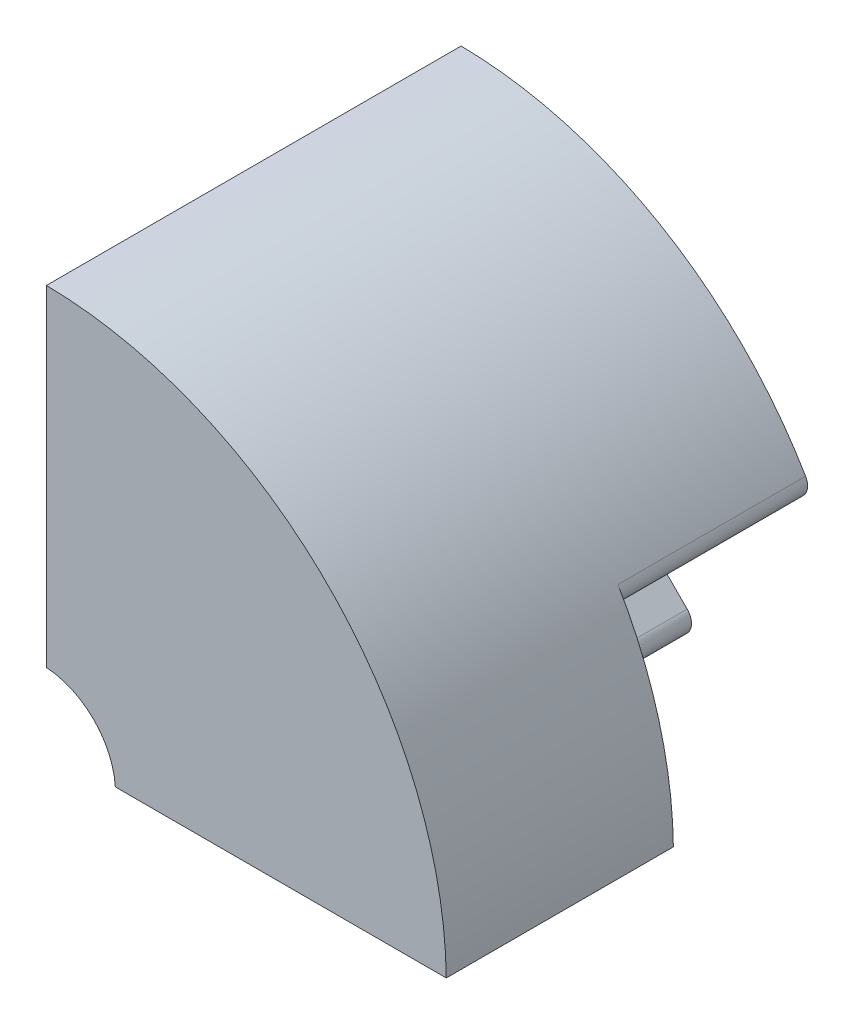
ISO-10303-21;
HEADER;
FILE_DESCRIPTION(('STEP AP214'),'2;1');
FILE_NAME('part.step','',(''),(''),'','','');
FILE_SCHEMA(('AUTOMOTIVE_DESIGN { 1 0 10303 214 1 1 1 1 }'));
ENDSEC;
DATA;
#1=APPLICATION_CONTEXT('core data for automotive mechanical design processes');
#2=APPLICATION_PROTOCOL_DEFINITION('international standard','automotive_design',2000,#1);
#3=PRODUCT_CONTEXT('',#1,'mechanical');
#4=PRODUCT('Part','Part','',(#3));
#5=PRODUCT_RELATED_PRODUCT_CATEGORY('part','',(#4));
#6=PRODUCT_DEFINITION_FORMATION('','',#4);
#7=PRODUCT_DEFINITION_CONTEXT('part definition',#1,'design');
#8=PRODUCT_DEFINITION('design','',#6,#7);
#9=PRODUCT_DEFINITION_SHAPE('','',#8);
#10=(LENGTH_UNIT() NAMED_UNIT(*) SI_UNIT(.MILLI.,.METRE.));
#11=(NAMED_UNIT(*) PLANE_ANGLE_UNIT() SI_UNIT($,.RADIAN.));
#12=(NAMED_UNIT(*) SI_UNIT($,.STERADIAN.) SOLID_ANGLE_UNIT());
#13=UNCERTAINTY_MEASURE_WITH_UNIT(LENGTH_MEASURE(1.E-05),#10,'distance_accuracy_value','');
#14=(GEOMETRIC_REPRESENTATION_CONTEXT(3) GLOBAL_UNCERTAINTY_ASSIGNED_CONTEXT((#13)) GLOBAL_UNIT_ASSIGNED_CONTEXT((#10,
#11,#12)) REPRESENTATION_CONTEXT('',''));
#15=CARTESIAN_POINT('',(0.,0.,0.));
#16=DIRECTION('',(0.,0.,1.));
#17=DIRECTION('',(1.,0.,0.));
#18=AXIS2_PLACEMENT_3D('',#15,#16,#17);
#19=CARTESIAN_POINT('',(0.,0.,-42.));
#20=DIRECTION('',(0.,0.,1.));
#21=DIRECTION('',(1.,0.,0.));
#22=AXIS2_PLACEMENT_3D('',#19,#20,#21);
#23=CYLINDRICAL_SURFACE('',#22,7.5);
#24=DIRECTION('',(0.,0.,1.));
#25=VECTOR('',#24,1.);
#26=CARTESIAN_POINT('',(0.499999999999973,7.48331477354788,-42.));
#27=LINE('',#26,#25);
#28=CARTESIAN_POINT('',(0.49999999999997,7.48331477354788,-27.));
#29=VERTEX_POINT('',#28);
#30=CARTESIAN_POINT('',(0.499999999999973,7.48331477354788,0.));
#31=VERTEX_POINT('',#30);
#32=EDGE_CURVE('E239',#29,#31,#27,.T.);
#33=ORIENTED_EDGE('',*,*,#32,.F.);
#34=CARTESIAN_POINT('',(0.,0.,-27.));
#35=DIRECTION('',(0.,0.,-1.));
#36=DIRECTION('',(-1.,0.,0.));
#37=AXIS2_PLACEMENT_3D('',#34,#35,#36);
#38=CIRCLE('',#37,7.5);
#39=CARTESIAN_POINT('',(7.48331477354788,0.500000000000028,-27.));
#40=VERTEX_POINT('',#39);
#41=EDGE_CURVE('E224',#29,#40,#38,.T.);
#42=ORIENTED_EDGE('',*,*,#41,.T.);
#43=DIRECTION('',(0.,0.,1.));
#44=VECTOR('',#43,1.);
#45=CARTESIAN_POINT('',(7.48331477354788,0.500000000000028,-42.));
#46=LINE('',#45,#44);
#47=CARTESIAN_POINT('',(7.48331477354788,0.500000000000028,0.));
#48=VERTEX_POINT('',#47);
#49=EDGE_CURVE('E247',#40,#48,#46,.T.);
#50=ORIENTED_EDGE('',*,*,#49,.T.);
#51=CARTESIAN_POINT('',(0.,0.,0.));
#52=DIRECTION('',(0.,0.,-1.));
#53=DIRECTION('',(1.,0.,0.));
#54=AXIS2_PLACEMENT_3D('',#51,#52,#53);
#55=CIRCLE('',#54,7.5);
#56=EDGE_CURVE('E244',#31,#48,#55,.T.);
#57=ORIENTED_EDGE('',*,*,#56,.F.);
#58=EDGE_LOOP('',(#33,#42,#50,#57));
#59=FACE_BOUND('',#58,.T.);
#60=ADVANCED_FACE('F42',(#59),#23,.F.);
#61=CARTESIAN_POINT('',(0.,0.,-42.));
#62=DIRECTION('',(0.,0.,1.));
#63=DIRECTION('',(1.,0.,0.));
#64=AXIS2_PLACEMENT_3D('',#61,#62,#63);
#65=CYLINDRICAL_SURFACE('',#64,41.);
#66=CARTESIAN_POINT('',(0.,0.,-23.));
#67=DIRECTION('',(0.,0.,-1.));
#68=DIRECTION('',(-1.,0.,0.));
#69=AXIS2_PLACEMENT_3D('',#66,#67,#68);
#70=CIRCLE('',#69,41.);
#71=CARTESIAN_POINT('',(40.9969511061493,0.500000000000022,-23.));
#72=VERTEX_POINT('',#71);
#73=CARTESIAN_POINT('',(35.3865219662676,20.7073432175849,-23.));
#74=VERTEX_POINT('',#73);
#75=EDGE_CURVE('E505',#72,#74,#70,.F.);
#76=ORIENTED_EDGE('',*,*,#75,.T.);
#77=DIRECTION('',(0.,0.,1.));
#78=VECTOR('',#77,1.);
#79=CARTESIAN_POINT('',(35.3865219662676,20.7073432175849,-42.));
#80=LINE('',#79,#78);
#81=CARTESIAN_POINT('',(35.3865219662676,20.7073432175849,-42.));
#82=VERTEX_POINT('',#81);
#83=EDGE_CURVE('E318',#74,#82,#80,.F.);
#84=ORIENTED_EDGE('',*,*,#83,.T.);
#85=CARTESIAN_POINT('',(0.,0.,-42.));
#86=DIRECTION('',(0.,0.,1.));
#87=DIRECTION('',(1.,0.,0.));
#88=AXIS2_PLACEMENT_3D('',#85,#86,#87);
#89=CIRCLE('',#88,41.);
#90=CARTESIAN_POINT('',(0.499999999999968,40.9969511061494,-42.));
#91=VERTEX_POINT('',#90);
#92=EDGE_CURVE('E561',#82,#91,#89,.T.);
#93=ORIENTED_EDGE('',*,*,#92,.T.);
#94=DIRECTION('',(0.,0.,1.));
#95=VECTOR('',#94,1.);
#96=CARTESIAN_POINT('',(0.499999999999968,40.9969511061494,-42.));
#97=LINE('',#96,#95);
#98=CARTESIAN_POINT('',(0.499999999999968,40.9969511061494,0.));
#99=VERTEX_POINT('',#98);
#100=EDGE_CURVE('E248',#91,#99,#97,.T.);
#101=ORIENTED_EDGE('',*,*,#100,.T.);
#102=CARTESIAN_POINT('',(0.,0.,0.));
#103=DIRECTION('',(0.,0.,1.));
#104=DIRECTION('',(1.,0.,0.));
#105=AXIS2_PLACEMENT_3D('',#102,#103,#104);
#106=CIRCLE('',#105,41.);
#107=CARTESIAN_POINT('',(40.9969511061494,0.500000000000029,0.));
#108=VERTEX_POINT('',#107);
#109=EDGE_CURVE('E553',#108,#99,#106,.T.);
#110=ORIENTED_EDGE('',*,*,#109,.F.);
#111=DIRECTION('',(0.,0.,1.));
#112=VECTOR('',#111,1.);
#113=CARTESIAN_POINT('',(40.9969511061494,0.500000000000029,-42.));
#114=LINE('',#113,#112);
#115=EDGE_CURVE('E252',#72,#108,#114,.T.);
#116=ORIENTED_EDGE('',*,*,#115,.F.);
#117=EDGE_LOOP('',(#76,#84,#93,#101,#110,#116));
#118=FACE_BOUND('',#117,.T.);
#119=ADVANCED_FACE('F398',(#118),#65,.T.);
#120=CARTESIAN_POINT('',(7.48331477354788,0.500000000000028,-42.));
#121=DIRECTION('',(0.,-1.,0.));
#122=DIRECTION('',(1.,0.,0.));
#123=AXIS2_PLACEMENT_3D('',#120,#121,#122);
#124=PLANE('',#123);
#125=DIRECTION('',(-1.,0.,0.));
#126=VECTOR('',#125,1.);
#127=CARTESIAN_POINT('',(0.499999999999971,0.500000000000028,-27.));
#128=LINE('',#127,#126);
#129=CARTESIAN_POINT('',(14.6421356237309,0.500000000000028,-27.));
#130=VERTEX_POINT('',#129);
#131=EDGE_CURVE('E229',#130,#40,#128,.T.);
#132=ORIENTED_EDGE('',*,*,#131,.F.);
#133=CARTESIAN_POINT('',(14.6421356237309,0.500000000000027,-30.));
#134=DIRECTION('',(0.,-1.,0.));
#135=DIRECTION('',(1.,0.,0.));
#136=AXIS2_PLACEMENT_3D('',#133,#134,#135);
#137=ELLIPSE('',#136,4.24264068711929,3.);
#138=CARTESIAN_POINT('',(18.0060966544099,0.500000000000028,-28.1719181932865));
#139=VERTEX_POINT('',#138);
#140=EDGE_CURVE('E11',#130,#139,#137,.F.);
#141=ORIENTED_EDGE('',*,*,#140,.T.);
#142=CARTESIAN_POINT('',(18.0060966544099,0.500000000000028,-28.1719181932865));
#143=CARTESIAN_POINT('',(18.0780374790311,0.500000000000028,-28.2381032540828));
#144=CARTESIAN_POINT('',(18.1482863095157,0.500000000000028,-28.3060812548936));
#145=CARTESIAN_POINT('',(18.2856277397146,0.500000000000028,-28.4450745879636));
#146=CARTESIAN_POINT('',(18.3527223127263,0.500000000000028,-28.5160879667377));
#147=CARTESIAN_POINT('',(18.5494341762897,0.500000000000028,-28.7326423636497));
#148=CARTESIAN_POINT('',(18.6748217771309,0.500000000000029,-28.8820197317656));
#149=CARTESIAN_POINT('',(18.919117831283,0.500000000000028,-29.1895484323767));
#150=CARTESIAN_POINT('',(19.037899091584,0.500000000000028,-29.3477985100827));
#151=CARTESIAN_POINT('',(19.271062885945,0.500000000000029,-29.6677068580553));
#152=CARTESIAN_POINT('',(19.3854407397626,0.50000000000003,-29.8293684864916));
#153=CARTESIAN_POINT('',(19.5018802860047,0.500000000000028,-29.9940371533154));
#154=CARTESIAN_POINT('',(19.5039884711615,0.500000000000028,-29.9970185773145));
#155=CARTESIAN_POINT('',(19.5060966544099,0.500000000000028,-30.));
#156=B_SPLINE_CURVE_WITH_KNOTS('',3,(#142,#143,#144,#145,#146,#147,#148,#149,#150,#151,#152,
#153,#154,#155),.UNSPECIFIED.,.F.,.F.,(4,2,2,2,2,2,4),(0.,0.293185172772144,0.586184419880159,
1.17077770268783,1.76424205277115,2.3583206792288,2.36927513037891),.UNSPECIFIED.);
#157=CARTESIAN_POINT('',(19.5060966544099,0.500000000000029,-30.));
#158=VERTEX_POINT('',#157);
#159=EDGE_CURVE('E373',#139,#158,#156,.T.);
#160=ORIENTED_EDGE('',*,*,#159,.T.);
#161=DIRECTION('',(0.,0.,-1.));
#162=VECTOR('',#161,1.);
#163=CARTESIAN_POINT('',(19.5060966544099,0.500000000000029,-42.));
#164=LINE('',#163,#162);
#165=CARTESIAN_POINT('',(19.5060966544099,0.500000000000028,-42.));
#166=VERTEX_POINT('',#165);
#167=EDGE_CURVE('E293',#158,#166,#164,.T.);
#168=ORIENTED_EDGE('',*,*,#167,.T.);
#169=DIRECTION('',(1.,0.,0.));
#170=VECTOR('',#169,1.);
#171=CARTESIAN_POINT('',(7.48331477354788,0.500000000000028,-42.));
#172=LINE('',#171,#170);
#173=CARTESIAN_POINT('',(22.3345237791561,0.500000000000028,-42.));
#174=VERTEX_POINT('',#173);
#175=EDGE_CURVE('E254',#166,#174,#172,.T.);
#176=ORIENTED_EDGE('',*,*,#175,.T.);
#177=DIRECTION('',(0.,0.,-1.));
#178=VECTOR('',#177,1.);
#179=CARTESIAN_POINT('',(22.3345237791561,0.500000000000029,-23.));
#180=LINE('',#179,#178);
#181=CARTESIAN_POINT('',(22.3345237791561,0.500000000000031,-23.));
#182=VERTEX_POINT('',#181);
#183=EDGE_CURVE('E289',#174,#182,#180,.F.);
#184=ORIENTED_EDGE('',*,*,#183,.T.);
#185=DIRECTION('',(1.,0.,0.));
#186=VECTOR('',#185,1.);
#187=CARTESIAN_POINT('',(25.9558441227157,0.50000000000003,-23.));
#188=LINE('',#187,#186);
#189=EDGE_CURVE('E585',#182,#72,#188,.T.);
#190=ORIENTED_EDGE('',*,*,#189,.T.);
#191=ORIENTED_EDGE('',*,*,#115,.T.);
#192=DIRECTION('',(1.,0.,0.));
#193=VECTOR('',#192,1.);
#194=CARTESIAN_POINT('',(7.48331477354788,0.500000000000028,0.));
#195=LINE('',#194,#193);
#196=EDGE_CURVE('E565',#48,#108,#195,.T.);
#197=ORIENTED_EDGE('',*,*,#196,.F.);
#198=ORIENTED_EDGE('',*,*,#49,.F.);
#199=EDGE_LOOP('',(#132,#141,#160,#168,#176,#184,#190,#191,#197,#198));
#200=FACE_BOUND('',#199,.T.);
#201=ADVANCED_FACE('F402',(#200),#124,.T.);
#202=CARTESIAN_POINT('',(0.499999999999968,40.9969511061494,-42.));
#203=DIRECTION('',(-1.,0.,0.));
#204=DIRECTION('',(0.,-1.,0.));
#205=AXIS2_PLACEMENT_3D('',#202,#203,#204);
#206=PLANE('',#205);
#207=DIRECTION('',(0.,-1.,0.));
#208=VECTOR('',#207,1.);
#209=CARTESIAN_POINT('',(0.499999999999968,40.9969511061494,-42.));
#210=LINE('',#209,#208);
#211=CARTESIAN_POINT('',(0.499999999999971,19.5060966544099,-42.));
#212=VERTEX_POINT('',#211);
#213=EDGE_CURVE('E564',#91,#212,#210,.T.);
#214=ORIENTED_EDGE('',*,*,#213,.T.);
#215=DIRECTION('',(0.,0.,-1.));
#216=VECTOR('',#215,1.);
#217=CARTESIAN_POINT('',(0.499999999999972,19.5060966544099,-27.));
#218=LINE('',#217,#216);
#219=CARTESIAN_POINT('',(0.499999999999972,19.5060966544099,-30.));
#220=VERTEX_POINT('',#219);
#221=EDGE_CURVE('E286',#212,#220,#218,.F.);
#222=ORIENTED_EDGE('',*,*,#221,.T.);
#223=CARTESIAN_POINT('',(0.499999999999971,18.0060966544099,-28.1719181932865));
#224=CARTESIAN_POINT('',(0.499999999999971,18.078037479031,-28.2381032540828));
#225=CARTESIAN_POINT('',(0.499999999999972,18.1482863095156,-28.3060812548934));
#226=CARTESIAN_POINT('',(0.499999999999971,18.2856277397143,-28.4450745879632));
#227=CARTESIAN_POINT('',(0.499999999999971,18.3527223127259,-28.5160879667371));
#228=CARTESIAN_POINT('',(0.499999999999972,18.5494341762893,-28.7326423636493));
#229=CARTESIAN_POINT('',(0.499999999999974,18.6748217771301,-28.8820197317658));
#230=CARTESIAN_POINT('',(0.499999999999969,18.9191178312837,-29.1895484323762));
#231=CARTESIAN_POINT('',(0.499999999999962,19.0378990915866,-29.3477985100808));
#232=CARTESIAN_POINT('',(0.499999999999981,19.2710628859424,-29.6677068580571));
#233=CARTESIAN_POINT('',(0.500000000000007,19.3854407397531,-29.8293684864983));
#234=CARTESIAN_POINT('',(0.499999999999971,19.5018802860044,-29.9940371533156));
#235=CARTESIAN_POINT('',(0.49999999999997,19.5039884711614,-29.9970185773146));
#236=CARTESIAN_POINT('',(0.499999999999969,19.5060966544099,-30.));
#237=B_SPLINE_CURVE_WITH_KNOTS('',3,(#223,#224,#225,#226,#227,#228,#229,#230,#231,#232,#233,
#234,#235,#236),.UNSPECIFIED.,.F.,.F.,(4,2,2,2,2,2,4),(0.,0.293185172771793,0.586184419879292,
1.17077770268776,1.7642420527711,2.35832067922879,2.36927513037891),.UNSPECIFIED.);
#238=CARTESIAN_POINT('',(0.499999999999971,18.0060966544099,-28.1719181932865));
#239=VERTEX_POINT('',#238);
#240=EDGE_CURVE('E67',#220,#239,#237,.F.);
#241=ORIENTED_EDGE('',*,*,#240,.T.);
#242=CARTESIAN_POINT('',(0.499999999999971,14.642135623731,-30.));
#243=DIRECTION('',(-1.,0.,0.));
#244=DIRECTION('',(0.,-1.,0.));
#245=AXIS2_PLACEMENT_3D('',#242,#243,#244);
#246=ELLIPSE('',#245,4.24264068711929,3.);
#247=CARTESIAN_POINT('',(0.499999999999968,14.642135623731,-27.));
#248=VERTEX_POINT('',#247);
#249=EDGE_CURVE('E53',#239,#248,#246,.F.);
#250=ORIENTED_EDGE('',*,*,#249,.T.);
#251=DIRECTION('',(0.,1.,0.));
#252=VECTOR('',#251,1.);
#253=CARTESIAN_POINT('',(0.499999999999968,18.8847763108503,-27.));
#254=LINE('',#253,#252);
#255=EDGE_CURVE('E227',#29,#248,#254,.T.);
#256=ORIENTED_EDGE('',*,*,#255,.F.);
#257=ORIENTED_EDGE('',*,*,#32,.T.);
#258=DIRECTION('',(0.,-1.,0.));
#259=VECTOR('',#258,1.);
#260=CARTESIAN_POINT('',(0.499999999999968,40.9969511061494,0.));
#261=LINE('',#260,#259);
#262=EDGE_CURVE('E574',#99,#31,#261,.T.);
#263=ORIENTED_EDGE('',*,*,#262,.F.);
#264=ORIENTED_EDGE('',*,*,#100,.F.);
#265=EDGE_LOOP('',(#214,#222,#241,#250,#256,#257,#263,#264));
#266=FACE_BOUND('',#265,.T.);
#267=ADVANCED_FACE('F237',(#266),#206,.T.);
#268=CARTESIAN_POINT('',(0.,0.,-42.));
#269=DIRECTION('',(0.,0.,1.));
#270=DIRECTION('',(1.,0.,0.));
#271=AXIS2_PLACEMENT_3D('',#268,#269,#270);
#272=PLANE('',#271);
#273=DIRECTION('',(0.707106781186548,-0.707106781186547,0.));
#274=VECTOR('',#273,1.);
#275=CARTESIAN_POINT('',(18.8847763108502,0.500000000000028,-42.));
#276=LINE('',#275,#274);
#277=CARTESIAN_POINT('',(0.939339828220153,18.4454364826301,-42.));
#278=VERTEX_POINT('',#277);
#279=CARTESIAN_POINT('',(18.44543648263,0.939339828220205,-42.));
#280=VERTEX_POINT('',#279);
#281=EDGE_CURVE('E593',#278,#280,#276,.T.);
#282=ORIENTED_EDGE('',*,*,#281,.F.);
#283=CARTESIAN_POINT('',(1.99999999999997,19.5060966544099,-42.));
#284=DIRECTION('',(0.,0.,1.));
#285=DIRECTION('',(1.,0.,0.));
#286=AXIS2_PLACEMENT_3D('',#283,#284,#285);
#287=CIRCLE('',#286,1.5);
#288=EDGE_CURVE('E283',#278,#212,#287,.F.);
#289=ORIENTED_EDGE('',*,*,#288,.T.);
#290=ORIENTED_EDGE('',*,*,#213,.F.);
#291=ORIENTED_EDGE('',*,*,#92,.F.);
#292=CARTESIAN_POINT('',(34.0918931138432,19.9497574901123,-42.));
#293=DIRECTION('',(0.,0.,1.));
#294=DIRECTION('',(1.,0.,0.));
#295=AXIS2_PLACEMENT_3D('',#292,#293,#294);
#296=CIRCLE('',#295,1.5);
#297=CARTESIAN_POINT('',(35.152553285623,18.8890973183325,-42.));
#298=VERTEX_POINT('',#297);
#299=EDGE_CURVE('E268',#82,#298,#296,.F.);
#300=ORIENTED_EDGE('',*,*,#299,.T.);
#301=DIRECTION('',(0.707106781186547,0.707106781186547,0.));
#302=VECTOR('',#301,1.);
#303=CARTESIAN_POINT('',(34.087572106361,17.8241161390705,-42.));
#304=LINE('',#303,#302);
#305=CARTESIAN_POINT('',(35.1482322781408,18.8847763108503,-42.));
#306=VERTEX_POINT('',#305);
#307=EDGE_CURVE('E643',#306,#298,#304,.T.);
#308=ORIENTED_EDGE('',*,*,#307,.F.);
#309=CARTESIAN_POINT('',(34.087572106361,19.9454364826301,-42.));
#310=DIRECTION('',(0.,0.,1.));
#311=DIRECTION('',(1.,0.,0.));
#312=AXIS2_PLACEMENT_3D('',#309,#310,#311);
#313=CIRCLE('',#312,1.5);
#314=CARTESIAN_POINT('',(33.0269119345812,18.8847763108503,-42.));
#315=VERTEX_POINT('',#314);
#316=EDGE_CURVE('E265',#306,#315,#313,.F.);
#317=ORIENTED_EDGE('',*,*,#316,.T.);
#318=DIRECTION('',(-0.707106781186547,0.707106781186548,0.));
#319=VECTOR('',#318,1.);
#320=CARTESIAN_POINT('',(25.9558441227158,25.9558441227157,-42.));
#321=LINE('',#320,#319);
#322=CARTESIAN_POINT('',(14.2885822331377,37.6231060122938,-42.));
#323=VERTEX_POINT('',#322);
#324=EDGE_CURVE('E529',#315,#323,#321,.T.);
#325=ORIENTED_EDGE('',*,*,#324,.T.);
#326=DIRECTION('',(-0.707106781186548,-0.707106781186547,0.));
#327=VECTOR('',#326,1.);
#328=CARTESIAN_POINT('',(-11.6672618895781,11.6672618895781,-42.));
#329=LINE('',#328,#327);
#330=CARTESIAN_POINT('',(12.5208152801713,35.8553390593274,-42.));
#331=VERTEX_POINT('',#330);
#332=EDGE_CURVE('E543',#323,#331,#329,.T.);
#333=ORIENTED_EDGE('',*,*,#332,.T.);
#334=CARTESIAN_POINT('',(11.4601551083915,36.9159992311072,-42.));
#335=DIRECTION('',(0.,0.,1.));
#336=DIRECTION('',(1.,0.,0.));
#337=AXIS2_PLACEMENT_3D('',#334,#335,#336);
#338=CIRCLE('',#337,1.5);
#339=CARTESIAN_POINT('',(10.3994949366116,35.8553390593274,-42.));
#340=VERTEX_POINT('',#339);
#341=EDGE_CURVE('E277',#331,#340,#338,.F.);
#342=ORIENTED_EDGE('',*,*,#341,.T.);
#343=DIRECTION('',(-0.707106781186548,0.707106781186548,0.));
#344=VECTOR('',#343,1.);
#345=CARTESIAN_POINT('',(23.1274169979695,23.1274169979695,-42.));
#346=LINE('',#345,#344);
#347=CARTESIAN_POINT('',(6.8639610306789,39.3908729652602,-42.));
#348=VERTEX_POINT('',#347);
#349=EDGE_CURVE('E540',#340,#348,#346,.T.);
#350=ORIENTED_EDGE('',*,*,#349,.T.);
#351=DIRECTION('',(-0.707106781186547,-0.707106781186548,0.));
#352=VECTOR('',#351,1.);
#353=CARTESIAN_POINT('',(-16.2634559672906,16.2634559672906,-42.));
#354=LINE('',#353,#352);
#355=CARTESIAN_POINT('',(2.62132034355963,35.1482322781409,-42.));
#356=VERTEX_POINT('',#355);
#357=EDGE_CURVE('E517',#348,#356,#354,.T.);
#358=ORIENTED_EDGE('',*,*,#357,.T.);
#359=DIRECTION('',(-0.707106781186548,0.707106781186548,0.));
#360=VECTOR('',#359,1.);
#361=CARTESIAN_POINT('',(18.8847763108502,18.8847763108502,-42.));
#362=LINE('',#361,#360);
#363=CARTESIAN_POINT('',(5.1669047558312,32.6026478658693,-42.));
#364=VERTEX_POINT('',#363);
#365=EDGE_CURVE('E512',#364,#356,#362,.T.);
#366=ORIENTED_EDGE('',*,*,#365,.F.);
#367=CARTESIAN_POINT('',(4.10624458405138,31.5419876940895,-42.));
#368=DIRECTION('',(0.,0.,1.));
#369=DIRECTION('',(1.,0.,0.));
#370=AXIS2_PLACEMENT_3D('',#367,#368,#369);
#371=CIRCLE('',#370,1.5);
#372=CARTESIAN_POINT('',(5.1669047558312,30.4813275223096,-42.));
#373=VERTEX_POINT('',#372);
#374=EDGE_CURVE('E274',#364,#373,#371,.F.);
#375=ORIENTED_EDGE('',*,*,#374,.T.);
#376=DIRECTION('',(0.707106781186547,0.707106781186548,0.));
#377=VECTOR('',#376,1.);
#378=CARTESIAN_POINT('',(6.22756492761102,31.5419876940895,-42.));
#379=LINE('',#378,#377);
#380=CARTESIAN_POINT('',(0.570710678118639,25.8851334445971,-42.));
#381=VERTEX_POINT('',#380);
#382=EDGE_CURVE('E662',#381,#373,#379,.T.);
#383=ORIENTED_EDGE('',*,*,#382,.F.);
#384=DIRECTION('',(-0.707106781186548,0.707106781186548,0.));
#385=VECTOR('',#384,1.);
#386=CARTESIAN_POINT('',(25.9558441227157,0.50000000000003,-42.));
#387=LINE('',#386,#385);
#388=CARTESIAN_POINT('',(23.3951839509359,3.06066017177985,-42.));
#389=VERTEX_POINT('',#388);
#390=EDGE_CURVE('E660',#389,#381,#387,.T.);
#391=ORIENTED_EDGE('',*,*,#390,.F.);
#392=CARTESIAN_POINT('',(22.3345237791561,2.00000000000003,-42.));
#393=DIRECTION('',(0.,0.,1.));
#394=DIRECTION('',(1.,0.,0.));
#395=AXIS2_PLACEMENT_3D('',#392,#393,#394);
#396=CIRCLE('',#395,1.5);
#397=EDGE_CURVE('E271',#389,#174,#396,.F.);
#398=ORIENTED_EDGE('',*,*,#397,.T.);
#399=ORIENTED_EDGE('',*,*,#175,.F.);
#400=CARTESIAN_POINT('',(19.5060966544099,2.00000000000003,-42.));
#401=DIRECTION('',(0.,0.,1.));
#402=DIRECTION('',(1.,0.,0.));
#403=AXIS2_PLACEMENT_3D('',#400,#401,#402);
#404=CIRCLE('',#403,1.5);
#405=EDGE_CURVE('E280',#166,#280,#404,.F.);
#406=ORIENTED_EDGE('',*,*,#405,.T.);
#407=EDGE_LOOP('',(#282,#289,#290,#291,#300,#308,#317,#325,#333,#342,#350,#358,#366,#375,#383,
#391,#398,#399,#406));
#408=FACE_BOUND('',#407,.T.);
#409=ADVANCED_FACE('F411',(#408),#272,.F.);
#410=CARTESIAN_POINT('',(0.,0.,0.));
#411=DIRECTION('',(0.,0.,1.));
#412=DIRECTION('',(1.,0.,0.));
#413=AXIS2_PLACEMENT_3D('',#410,#411,#412);
#414=PLANE('',#413);
#415=ORIENTED_EDGE('',*,*,#109,.T.);
#416=ORIENTED_EDGE('',*,*,#262,.T.);
#417=ORIENTED_EDGE('',*,*,#56,.T.);
#418=ORIENTED_EDGE('',*,*,#196,.T.);
#419=EDGE_LOOP('',(#415,#416,#417,#418));
#420=FACE_BOUND('',#419,.T.);
#421=ADVANCED_FACE('F407',(#420),#414,.T.);
#422=CARTESIAN_POINT('',(25.9558441227158,25.9558441227157,-23.));
#423=DIRECTION('',(-0.707106781186548,-0.707106781186547,0.));
#424=DIRECTION('',(0.707106781186547,-0.707106781186548,0.));
#425=AXIS2_PLACEMENT_3D('',#422,#423,#424);
#426=PLANE('',#425);
#427=ORIENTED_EDGE('',*,*,#324,.F.);
#428=DIRECTION('',(0.,0.,-1.));
#429=VECTOR('',#428,1.);
#430=CARTESIAN_POINT('',(33.0269119345812,18.8847763108503,-23.));
#431=LINE('',#430,#429);
#432=CARTESIAN_POINT('',(33.0269119345812,18.8847763108503,-23.));
#433=VERTEX_POINT('',#432);
#434=EDGE_CURVE('E332',#315,#433,#431,.F.);
#435=ORIENTED_EDGE('',*,*,#434,.T.);
#436=DIRECTION('',(0.707106781186547,-0.707106781186548,0.));
#437=VECTOR('',#436,1.);
#438=CARTESIAN_POINT('',(25.9558441227158,25.9558441227157,-23.));
#439=LINE('',#438,#437);
#440=CARTESIAN_POINT('',(34.087572106361,17.8241161390705,-23.));
#441=VERTEX_POINT('',#440);
#442=EDGE_CURVE('E329',#433,#441,#439,.T.);
#443=ORIENTED_EDGE('',*,*,#442,.T.);
#444=DIRECTION('',(0.,0.,-1.));
#445=VECTOR('',#444,1.);
#446=CARTESIAN_POINT('',(34.087572106361,17.8241161390705,-1.));
#447=LINE('',#446,#445);
#448=CARTESIAN_POINT('',(34.087572106361,17.8241161390705,-1.));
#449=VERTEX_POINT('',#448);
#450=EDGE_CURVE('E632',#449,#441,#447,.T.);
#451=ORIENTED_EDGE('',*,*,#450,.F.);
#452=DIRECTION('',(0.707106781186547,-0.707106781186548,0.));
#453=VECTOR('',#452,1.);
#454=CARTESIAN_POINT('',(14.2885822331377,37.6231060122938,-1.));
#455=LINE('',#454,#453);
#456=CARTESIAN_POINT('',(14.2885822331377,37.6231060122938,-1.));
#457=VERTEX_POINT('',#456);
#458=EDGE_CURVE('E619',#457,#449,#455,.T.);
#459=ORIENTED_EDGE('',*,*,#458,.F.);
#460=DIRECTION('',(0.,0.,-1.));
#461=VECTOR('',#460,1.);
#462=CARTESIAN_POINT('',(14.2885822331377,37.6231060122938,-23.));
#463=LINE('',#462,#461);
#464=EDGE_CURVE('E549',#457,#323,#463,.T.);
#465=ORIENTED_EDGE('',*,*,#464,.T.);
#466=EDGE_LOOP('',(#427,#435,#443,#451,#459,#465));
#467=FACE_BOUND('',#466,.T.);
#468=ADVANCED_FACE('F410',(#467),#426,.T.);
#469=CARTESIAN_POINT('',(-11.6672618895781,11.6672618895781,-23.));
#470=DIRECTION('',(0.707106781186547,-0.707106781186549,0.));
#471=DIRECTION('',(0.707106781186549,0.707106781186547,0.));
#472=AXIS2_PLACEMENT_3D('',#469,#470,#471);
#473=PLANE('',#472);
#474=DIRECTION('',(0.707106781186549,0.707106781186547,0.));
#475=VECTOR('',#474,1.);
#476=CARTESIAN_POINT('',(-11.6672618895781,11.6672618895781,-23.));
#477=LINE('',#476,#475);
#478=CARTESIAN_POINT('',(11.4601551083915,34.7946788875476,-23.));
#479=VERTEX_POINT('',#478);
#480=CARTESIAN_POINT('',(12.5208152801713,35.8553390593274,-23.));
#481=VERTEX_POINT('',#480);
#482=EDGE_CURVE('E296',#479,#481,#477,.T.);
#483=ORIENTED_EDGE('',*,*,#482,.T.);
#484=DIRECTION('',(0.,0.,-1.));
#485=VECTOR('',#484,1.);
#486=CARTESIAN_POINT('',(12.5208152801713,35.8553390593274,-23.));
#487=LINE('',#486,#485);
#488=EDGE_CURVE('E300',#481,#331,#487,.T.);
#489=ORIENTED_EDGE('',*,*,#488,.T.);
#490=ORIENTED_EDGE('',*,*,#332,.F.);
#491=ORIENTED_EDGE('',*,*,#464,.F.);
#492=DIRECTION('',(0.707106781186548,0.707106781186547,0.));
#493=VECTOR('',#492,1.);
#494=CARTESIAN_POINT('',(14.2885822331377,37.6231060122938,-1.));
#495=LINE('',#494,#493);
#496=CARTESIAN_POINT('',(11.4601551083915,34.7946788875476,-1.));
#497=VERTEX_POINT('',#496);
#498=EDGE_CURVE('E615',#497,#457,#495,.T.);
#499=ORIENTED_EDGE('',*,*,#498,.F.);
#500=DIRECTION('',(0.,0.,-1.));
#501=VECTOR('',#500,1.);
#502=CARTESIAN_POINT('',(11.4601551083915,34.7946788875476,-1.));
#503=LINE('',#502,#501);
#504=EDGE_CURVE('E639',#497,#479,#503,.T.);
#505=ORIENTED_EDGE('',*,*,#504,.T.);
#506=EDGE_LOOP('',(#483,#489,#490,#491,#499,#505));
#507=FACE_BOUND('',#506,.T.);
#508=ADVANCED_FACE('F426',(#507),#473,.T.);
#509=CARTESIAN_POINT('',(23.1274169979695,23.1274169979695,-23.));
#510=DIRECTION('',(-0.707106781186548,-0.707106781186548,0.));
#511=DIRECTION('',(0.707106781186548,-0.707106781186548,0.));
#512=AXIS2_PLACEMENT_3D('',#509,#510,#511);
#513=PLANE('',#512);
#514=ORIENTED_EDGE('',*,*,#349,.F.);
#515=DIRECTION('',(0.,0.,-1.));
#516=VECTOR('',#515,1.);
#517=CARTESIAN_POINT('',(10.3994949366116,35.8553390593274,-23.));
#518=LINE('',#517,#516);
#519=CARTESIAN_POINT('',(10.3994949366116,35.8553390593274,-23.));
#520=VERTEX_POINT('',#519);
#521=EDGE_CURVE('E304',#340,#520,#518,.F.);
#522=ORIENTED_EDGE('',*,*,#521,.T.);
#523=DIRECTION('',(-0.707106781186548,0.707106781186548,0.));
#524=VECTOR('',#523,1.);
#525=CARTESIAN_POINT('',(23.1274169979695,23.1274169979695,-23.));
#526=LINE('',#525,#524);
#527=CARTESIAN_POINT('',(6.8639610306789,39.3908729652602,-23.));
#528=VERTEX_POINT('',#527);
#529=EDGE_CURVE('E533',#520,#528,#526,.T.);
#530=ORIENTED_EDGE('',*,*,#529,.T.);
#531=DIRECTION('',(0.,0.,-1.));
#532=VECTOR('',#531,1.);
#533=CARTESIAN_POINT('',(6.8639610306789,39.3908729652602,-23.));
#534=LINE('',#533,#532);
#535=EDGE_CURVE('E554',#528,#348,#534,.T.);
#536=ORIENTED_EDGE('',*,*,#535,.T.);
#537=EDGE_LOOP('',(#514,#522,#530,#536));
#538=FACE_BOUND('',#537,.T.);
#539=ADVANCED_FACE('F424',(#538),#513,.T.);
#540=CARTESIAN_POINT('',(-16.2634559672906,16.2634559672906,-23.));
#541=DIRECTION('',(0.707106781186548,-0.707106781186547,0.));
#542=DIRECTION('',(0.707106781186547,0.707106781186548,0.));
#543=AXIS2_PLACEMENT_3D('',#540,#541,#542);
#544=PLANE('',#543);
#545=ORIENTED_EDGE('',*,*,#357,.F.);
#546=ORIENTED_EDGE('',*,*,#535,.F.);
#547=DIRECTION('',(-0.707106781186547,-0.707106781186548,0.));
#548=VECTOR('',#547,1.);
#549=CARTESIAN_POINT('',(-16.2634559672906,16.2634559672906,-23.));
#550=LINE('',#549,#548);
#551=CARTESIAN_POINT('',(2.62132034355963,35.1482322781409,-23.));
#552=VERTEX_POINT('',#551);
#553=EDGE_CURVE('E528',#528,#552,#550,.T.);
#554=ORIENTED_EDGE('',*,*,#553,.T.);
#555=DIRECTION('',(0.,0.,-1.));
#556=VECTOR('',#555,1.);
#557=CARTESIAN_POINT('',(2.62132034355963,35.1482322781409,-23.));
#558=LINE('',#557,#556);
#559=EDGE_CURVE('E535',#552,#356,#558,.T.);
#560=ORIENTED_EDGE('',*,*,#559,.T.);
#561=EDGE_LOOP('',(#545,#546,#554,#560));
#562=FACE_BOUND('',#561,.T.);
#563=ADVANCED_FACE('F420',(#562),#544,.T.);
#564=CARTESIAN_POINT('',(18.8847763108502,18.8847763108502,-23.));
#565=DIRECTION('',(-0.707106781186548,-0.707106781186548,0.));
#566=DIRECTION('',(0.707106781186548,-0.707106781186548,0.));
#567=AXIS2_PLACEMENT_3D('',#564,#565,#566);
#568=PLANE('',#567);
#569=DIRECTION('',(-0.707106781186548,0.707106781186548,0.));
#570=VECTOR('',#569,1.);
#571=CARTESIAN_POINT('',(18.8847763108502,18.8847763108502,-23.));
#572=LINE('',#571,#570);
#573=CARTESIAN_POINT('',(5.1669047558312,32.6026478658693,-23.));
#574=VERTEX_POINT('',#573);
#575=EDGE_CURVE('E525',#574,#552,#572,.T.);
#576=ORIENTED_EDGE('',*,*,#575,.F.);
#577=DIRECTION('',(0.,0.,-1.));
#578=VECTOR('',#577,1.);
#579=CARTESIAN_POINT('',(5.1669047558312,32.6026478658693,-23.));
#580=LINE('',#579,#578);
#581=EDGE_CURVE('E307',#574,#364,#580,.T.);
#582=ORIENTED_EDGE('',*,*,#581,.T.);
#583=ORIENTED_EDGE('',*,*,#365,.T.);
#584=ORIENTED_EDGE('',*,*,#559,.F.);
#585=EDGE_LOOP('',(#576,#582,#583,#584));
#586=FACE_BOUND('',#585,.T.);
#587=ADVANCED_FACE('F416',(#586),#568,.F.);
#588=CARTESIAN_POINT('',(0.,0.,-23.));
#589=DIRECTION('',(0.,0.,-1.));
#590=DIRECTION('',(-1.,0.,0.));
#591=AXIS2_PLACEMENT_3D('',#588,#589,#590);
#592=PLANE('',#591);
#593=DIRECTION('',(-0.707106781186547,0.707106781186548,0.));
#594=VECTOR('',#593,1.);
#595=CARTESIAN_POINT('',(11.4601551083915,34.7946788875476,-23.));
#596=LINE('',#595,#594);
#597=CARTESIAN_POINT('',(31.2591449816148,14.9956890143243,-23.));
#598=VERTEX_POINT('',#597);
#599=EDGE_CURVE('E620',#598,#479,#596,.T.);
#600=ORIENTED_EDGE('',*,*,#599,.F.);
#601=DIRECTION('',(-0.707106781186548,-0.707106781186548,0.));
#602=VECTOR('',#601,1.);
#603=CARTESIAN_POINT('',(34.087572106361,17.8241161390705,-23.));
#604=LINE('',#603,#602);
#605=EDGE_CURVE('E234',#441,#598,#604,.T.);
#606=ORIENTED_EDGE('',*,*,#605,.F.);
#607=ORIENTED_EDGE('',*,*,#442,.F.);
#608=CARTESIAN_POINT('',(34.087572106361,19.9454364826301,-23.));
#609=DIRECTION('',(0.,0.,-1.));
#610=DIRECTION('',(-1.,0.,0.));
#611=AXIS2_PLACEMENT_3D('',#608,#609,#610);
#612=CIRCLE('',#611,1.5);
#613=CARTESIAN_POINT('',(35.1482322781408,18.8847763108503,-23.));
#614=VERTEX_POINT('',#613);
#615=EDGE_CURVE('E349',#433,#614,#612,.F.);
#616=ORIENTED_EDGE('',*,*,#615,.T.);
#617=DIRECTION('',(-0.707106781186548,-0.707106781186548,0.));
#618=VECTOR('',#617,1.);
#619=CARTESIAN_POINT('',(34.087572106361,17.8241161390705,-23.));
#620=LINE('',#619,#618);
#621=CARTESIAN_POINT('',(35.152553285623,18.8890973183325,-23.));
#622=VERTEX_POINT('',#621);
#623=EDGE_CURVE('E508',#622,#614,#620,.T.);
#624=ORIENTED_EDGE('',*,*,#623,.F.);
#625=CARTESIAN_POINT('',(34.0918931138432,19.9497574901123,-23.));
#626=DIRECTION('',(0.,0.,-1.));
#627=DIRECTION('',(-1.,0.,0.));
#628=AXIS2_PLACEMENT_3D('',#625,#626,#627);
#629=CIRCLE('',#628,1.5);
#630=EDGE_CURVE('E345',#622,#74,#629,.F.);
#631=ORIENTED_EDGE('',*,*,#630,.T.);
#632=ORIENTED_EDGE('',*,*,#75,.F.);
#633=ORIENTED_EDGE('',*,*,#189,.F.);
#634=CARTESIAN_POINT('',(22.3345237791561,2.00000000000003,-23.));
#635=DIRECTION('',(0.,0.,-1.));
#636=DIRECTION('',(-1.,0.,0.));
#637=AXIS2_PLACEMENT_3D('',#634,#635,#636);
#638=CIRCLE('',#637,1.5);
#639=CARTESIAN_POINT('',(23.3951839509359,3.06066017177985,-23.));
#640=VERTEX_POINT('',#639);
#641=EDGE_CURVE('E342',#182,#640,#638,.F.);
#642=ORIENTED_EDGE('',*,*,#641,.T.);
#643=DIRECTION('',(0.707106781186548,-0.707106781186548,0.));
#644=VECTOR('',#643,1.);
#645=CARTESIAN_POINT('',(25.9558441227157,0.50000000000003,-23.));
#646=LINE('',#645,#644);
#647=CARTESIAN_POINT('',(0.57071067811864,25.8851334445971,-23.));
#648=VERTEX_POINT('',#647);
#649=EDGE_CURVE('E519',#648,#640,#646,.T.);
#650=ORIENTED_EDGE('',*,*,#649,.F.);
#651=DIRECTION('',(-0.707106781186547,-0.707106781186548,0.));
#652=VECTOR('',#651,1.);
#653=CARTESIAN_POINT('',(6.22756492761102,31.5419876940895,-23.));
#654=LINE('',#653,#652);
#655=CARTESIAN_POINT('',(5.1669047558312,30.4813275223096,-23.));
#656=VERTEX_POINT('',#655);
#657=EDGE_CURVE('E513',#656,#648,#654,.T.);
#658=ORIENTED_EDGE('',*,*,#657,.F.);
#659=CARTESIAN_POINT('',(4.10624458405138,31.5419876940895,-23.));
#660=DIRECTION('',(0.,0.,-1.));
#661=DIRECTION('',(-1.,0.,0.));
#662=AXIS2_PLACEMENT_3D('',#659,#660,#661);
#663=CIRCLE('',#662,1.5);
#664=EDGE_CURVE('E339',#656,#574,#663,.F.);
#665=ORIENTED_EDGE('',*,*,#664,.T.);
#666=ORIENTED_EDGE('',*,*,#575,.T.);
#667=ORIENTED_EDGE('',*,*,#553,.F.);
#668=ORIENTED_EDGE('',*,*,#529,.F.);
#669=CARTESIAN_POINT('',(11.4601551083915,36.9159992311072,-23.));
#670=DIRECTION('',(0.,0.,-1.));
#671=DIRECTION('',(-1.,0.,0.));
#672=AXIS2_PLACEMENT_3D('',#669,#670,#671);
#673=CIRCLE('',#672,1.5);
#674=EDGE_CURVE('E336',#520,#481,#673,.F.);
#675=ORIENTED_EDGE('',*,*,#674,.T.);
#676=ORIENTED_EDGE('',*,*,#482,.F.);
#677=EDGE_LOOP('',(#600,#606,#607,#616,#624,#631,#632,#633,#642,#650,#658,#665,#666,#667,#668,
#675,#676));
#678=FACE_BOUND('',#677,.T.);
#679=ADVANCED_FACE('F419',(#678),#592,.T.);
#680=CARTESIAN_POINT('',(6.22756492761102,31.5419876940895,27.9694606126545));
#681=DIRECTION('',(-0.707106781186548,0.707106781186547,0.));
#682=DIRECTION('',(-0.707106781186547,-0.707106781186548,0.));
#683=AXIS2_PLACEMENT_3D('',#680,#681,#682);
#684=PLANE('',#683);
#685=ORIENTED_EDGE('',*,*,#382,.T.);
#686=DIRECTION('',(0.,0.,-1.));
#687=VECTOR('',#686,1.);
#688=CARTESIAN_POINT('',(5.1669047558312,30.4813275223096,27.9694606126545));
#689=LINE('',#688,#687);
#690=EDGE_CURVE('E311',#373,#656,#689,.F.);
#691=ORIENTED_EDGE('',*,*,#690,.T.);
#692=ORIENTED_EDGE('',*,*,#657,.T.);
#693=DIRECTION('',(0.,0.,-1.));
#694=VECTOR('',#693,1.);
#695=CARTESIAN_POINT('',(0.570710678118639,25.8851334445971,27.9694606126545));
#696=LINE('',#695,#694);
#697=EDGE_CURVE('E523',#648,#381,#696,.T.);
#698=ORIENTED_EDGE('',*,*,#697,.T.);
#699=EDGE_LOOP('',(#685,#691,#692,#698));
#700=FACE_BOUND('',#699,.T.);
#701=ADVANCED_FACE('F438',(#700),#684,.F.);
#702=CARTESIAN_POINT('',(25.9558441227157,0.50000000000003,27.9694606126545));
#703=DIRECTION('',(-0.707106781186548,-0.707106781186548,0.));
#704=DIRECTION('',(0.707106781186548,-0.707106781186548,0.));
#705=AXIS2_PLACEMENT_3D('',#702,#703,#704);
#706=PLANE('',#705);
#707=ORIENTED_EDGE('',*,*,#649,.T.);
#708=DIRECTION('',(0.,0.,-1.));
#709=VECTOR('',#708,1.);
#710=CARTESIAN_POINT('',(23.3951839509359,3.06066017177985,-42.));
#711=LINE('',#710,#709);
#712=EDGE_CURVE('E314',#640,#389,#711,.T.);
#713=ORIENTED_EDGE('',*,*,#712,.T.);
#714=ORIENTED_EDGE('',*,*,#390,.T.);
#715=ORIENTED_EDGE('',*,*,#697,.F.);
#716=EDGE_LOOP('',(#707,#713,#714,#715));
#717=FACE_BOUND('',#716,.T.);
#718=ADVANCED_FACE('F444',(#717),#706,.F.);
#719=CARTESIAN_POINT('',(34.087572106361,17.8241161390705,27.9694606126545));
#720=DIRECTION('',(-0.707106781186548,0.707106781186548,0.));
#721=DIRECTION('',(-0.707106781186548,-0.707106781186548,0.));
#722=AXIS2_PLACEMENT_3D('',#719,#720,#721);
#723=PLANE('',#722);
#724=ORIENTED_EDGE('',*,*,#307,.T.);
#725=DIRECTION('',(0.,0.,-1.));
#726=VECTOR('',#725,1.);
#727=CARTESIAN_POINT('',(35.152553285623,18.8890973183325,-23.));
#728=LINE('',#727,#726);
#729=EDGE_CURVE('E326',#298,#622,#728,.F.);
#730=ORIENTED_EDGE('',*,*,#729,.T.);
#731=ORIENTED_EDGE('',*,*,#623,.T.);
#732=DIRECTION('',(0.,0.,-1.));
#733=VECTOR('',#732,1.);
#734=CARTESIAN_POINT('',(35.1482322781408,18.8847763108503,-42.));
#735=LINE('',#734,#733);
#736=EDGE_CURVE('E322',#614,#306,#735,.T.);
#737=ORIENTED_EDGE('',*,*,#736,.T.);
#738=EDGE_LOOP('',(#724,#730,#731,#737));
#739=FACE_BOUND('',#738,.T.);
#740=ADVANCED_FACE('F440',(#739),#723,.F.);
#741=CARTESIAN_POINT('',(11.4601551083915,34.7946788875476,-1.));
#742=DIRECTION('',(-0.707106781186548,-0.707106781186547,0.));
#743=DIRECTION('',(0.707106781186547,-0.707106781186548,0.));
#744=AXIS2_PLACEMENT_3D('',#741,#742,#743);
#745=PLANE('',#744);
#746=ORIENTED_EDGE('',*,*,#599,.T.);
#747=ORIENTED_EDGE('',*,*,#504,.F.);
#748=DIRECTION('',(-0.707106781186547,0.707106781186548,0.));
#749=VECTOR('',#748,1.);
#750=CARTESIAN_POINT('',(11.4601551083915,34.7946788875476,-1.));
#751=LINE('',#750,#749);
#752=CARTESIAN_POINT('',(31.2591449816148,14.9956890143243,-1.));
#753=VERTEX_POINT('',#752);
#754=EDGE_CURVE('E628',#753,#497,#751,.T.);
#755=ORIENTED_EDGE('',*,*,#754,.F.);
#756=DIRECTION('',(0.,0.,-1.));
#757=VECTOR('',#756,1.);
#758=CARTESIAN_POINT('',(31.2591449816148,14.9956890143243,-1.));
#759=LINE('',#758,#757);
#760=EDGE_CURVE('E644',#753,#598,#759,.T.);
#761=ORIENTED_EDGE('',*,*,#760,.T.);
#762=EDGE_LOOP('',(#746,#747,#755,#761));
#763=FACE_BOUND('',#762,.T.);
#764=ADVANCED_FACE('F443',(#763),#745,.F.);
#765=CARTESIAN_POINT('',(34.087572106361,17.8241161390705,-1.));
#766=DIRECTION('',(0.707106781186548,-0.707106781186548,0.));
#767=DIRECTION('',(0.707106781186548,0.707106781186548,0.));
#768=AXIS2_PLACEMENT_3D('',#765,#766,#767);
#769=PLANE('',#768);
#770=ORIENTED_EDGE('',*,*,#605,.T.);
#771=ORIENTED_EDGE('',*,*,#760,.F.);
#772=DIRECTION('',(-0.707106781186548,-0.707106781186548,0.));
#773=VECTOR('',#772,1.);
#774=CARTESIAN_POINT('',(34.087572106361,17.8241161390705,-1.));
#775=LINE('',#774,#773);
#776=EDGE_CURVE('E624',#449,#753,#775,.T.);
#777=ORIENTED_EDGE('',*,*,#776,.F.);
#778=ORIENTED_EDGE('',*,*,#450,.T.);
#779=EDGE_LOOP('',(#770,#771,#777,#778));
#780=FACE_BOUND('',#779,.T.);
#781=ADVANCED_FACE('F452',(#780),#769,.F.);
#782=CARTESIAN_POINT('',(0.,0.,-1.));
#783=DIRECTION('',(0.,0.,1.));
#784=DIRECTION('',(1.,0.,0.));
#785=AXIS2_PLACEMENT_3D('',#782,#783,#784);
#786=PLANE('',#785);
#787=ORIENTED_EDGE('',*,*,#498,.T.);
#788=ORIENTED_EDGE('',*,*,#458,.T.);
#789=ORIENTED_EDGE('',*,*,#776,.T.);
#790=ORIENTED_EDGE('',*,*,#754,.T.);
#791=EDGE_LOOP('',(#787,#788,#789,#790));
#792=FACE_BOUND('',#791,.T.);
#793=ADVANCED_FACE('F455',(#792),#786,.F.);
#794=CARTESIAN_POINT('',(18.8847763108502,0.500000000000028,-27.));
#795=DIRECTION('',(0.707106781186547,0.707106781186548,0.));
#796=DIRECTION('',(-0.707106781186548,0.707106781186547,0.));
#797=AXIS2_PLACEMENT_3D('',#794,#795,#796);
#798=PLANE('',#797);
#799=DIRECTION('',(0.,0.,-1.));
#800=VECTOR('',#799,1.);
#801=CARTESIAN_POINT('',(18.44543648263,0.939339828220206,-27.));
#802=LINE('',#801,#800);
#803=CARTESIAN_POINT('',(18.44543648263,0.939339828220206,-30.));
#804=VERTEX_POINT('',#803);
#805=EDGE_CURVE('E258',#280,#804,#802,.F.);
#806=ORIENTED_EDGE('',*,*,#805,.T.);
#807=DIRECTION('',(0.707106781186548,-0.707106781186547,0.));
#808=VECTOR('',#807,1.);
#809=CARTESIAN_POINT('',(18.8847763108502,0.500000000000028,-30.));
#810=LINE('',#809,#808);
#811=CARTESIAN_POINT('',(0.939339828220148,18.4454364826301,-30.));
#812=VERTEX_POINT('',#811);
#813=EDGE_CURVE('E362',#804,#812,#810,.F.);
#814=ORIENTED_EDGE('',*,*,#813,.T.);
#815=DIRECTION('',(0.,0.,-1.));
#816=VECTOR('',#815,1.);
#817=CARTESIAN_POINT('',(0.939339828220148,18.4454364826301,-42.));
#818=LINE('',#817,#816);
#819=EDGE_CURVE('E262',#812,#278,#818,.T.);
#820=ORIENTED_EDGE('',*,*,#819,.T.);
#821=ORIENTED_EDGE('',*,*,#281,.T.);
#822=EDGE_LOOP('',(#806,#814,#820,#821));
#823=FACE_BOUND('',#822,.T.);
#824=ADVANCED_FACE('F462',(#823),#798,.F.);
#825=CARTESIAN_POINT('',(0.,0.,-27.));
#826=DIRECTION('',(0.,0.,-1.));
#827=DIRECTION('',(-1.,0.,0.));
#828=AXIS2_PLACEMENT_3D('',#825,#826,#827);
#829=PLANE('',#828);
#830=ORIENTED_EDGE('',*,*,#255,.T.);
#831=DIRECTION('',(0.707106781186548,-0.707106781186547,0.));
#832=VECTOR('',#831,1.);
#833=CARTESIAN_POINT('',(7.57106781186548,7.57106781186548,-27.));
#834=LINE('',#833,#832);
#835=EDGE_CURVE('E359',#248,#130,#834,.T.);
#836=ORIENTED_EDGE('',*,*,#835,.T.);
#837=ORIENTED_EDGE('',*,*,#131,.T.);
#838=ORIENTED_EDGE('',*,*,#41,.F.);
#839=EDGE_LOOP('',(#830,#836,#837,#838));
#840=FACE_BOUND('',#839,.T.);
#841=ADVANCED_FACE('F226',(#840),#829,.T.);
#842=CARTESIAN_POINT('',(1.99999999999997,19.5060966544099,-27.));
#843=DIRECTION('',(0.,0.,1.));
#844=DIRECTION('',(1.,0.,0.));
#845=AXIS2_PLACEMENT_3D('',#842,#843,#844);
#846=CYLINDRICAL_SURFACE('',#845,1.5);
#847=ORIENTED_EDGE('',*,*,#819,.F.);
#848=CARTESIAN_POINT('',(1.99999999999997,19.5060966544099,-30.));
#849=DIRECTION('',(0.,0.,-1.));
#850=DIRECTION('',(-1.,0.,0.));
#851=AXIS2_PLACEMENT_3D('',#848,#849,#850);
#852=CIRCLE('',#851,1.5);
#853=EDGE_CURVE('E352',#812,#220,#852,.T.);
#854=ORIENTED_EDGE('',*,*,#853,.T.);
#855=ORIENTED_EDGE('',*,*,#221,.F.);
#856=ORIENTED_EDGE('',*,*,#288,.F.);
#857=EDGE_LOOP('',(#847,#854,#855,#856));
#858=FACE_BOUND('',#857,.T.);
#859=ADVANCED_FACE('F468',(#858),#846,.T.);
#860=CARTESIAN_POINT('',(19.5060966544099,2.00000000000003,-42.));
#861=DIRECTION('',(0.,0.,1.));
#862=DIRECTION('',(1.,0.,0.));
#863=AXIS2_PLACEMENT_3D('',#860,#861,#862);
#864=CYLINDRICAL_SURFACE('',#863,1.5);
#865=ORIENTED_EDGE('',*,*,#167,.F.);
#866=CARTESIAN_POINT('',(19.5060966544099,2.00000000000003,-30.));
#867=DIRECTION('',(0.,0.,-1.));
#868=DIRECTION('',(-1.,0.,0.));
#869=AXIS2_PLACEMENT_3D('',#866,#867,#868);
#870=CIRCLE('',#869,1.5);
#871=EDGE_CURVE('E356',#158,#804,#870,.T.);
#872=ORIENTED_EDGE('',*,*,#871,.T.);
#873=ORIENTED_EDGE('',*,*,#805,.F.);
#874=ORIENTED_EDGE('',*,*,#405,.F.);
#875=EDGE_LOOP('',(#865,#872,#873,#874));
#876=FACE_BOUND('',#875,.T.);
#877=ADVANCED_FACE('F472',(#876),#864,.T.);
#878=CARTESIAN_POINT('',(11.4601551083915,36.9159992311072,-23.));
#879=DIRECTION('',(0.,0.,-1.));
#880=DIRECTION('',(-1.,0.,0.));
#881=AXIS2_PLACEMENT_3D('',#878,#879,#880);
#882=CYLINDRICAL_SURFACE('',#881,1.5);
#883=ORIENTED_EDGE('',*,*,#674,.F.);
#884=ORIENTED_EDGE('',*,*,#521,.F.);
#885=ORIENTED_EDGE('',*,*,#341,.F.);
#886=ORIENTED_EDGE('',*,*,#488,.F.);
#887=EDGE_LOOP('',(#883,#884,#885,#886));
#888=FACE_BOUND('',#887,.T.);
#889=ADVANCED_FACE('F478',(#888),#882,.T.);
#890=CARTESIAN_POINT('',(4.10624458405138,31.5419876940895,-23.));
#891=DIRECTION('',(0.,0.,-1.));
#892=DIRECTION('',(-1.,0.,0.));
#893=AXIS2_PLACEMENT_3D('',#890,#891,#892);
#894=CYLINDRICAL_SURFACE('',#893,1.5);
#895=ORIENTED_EDGE('',*,*,#664,.F.);
#896=ORIENTED_EDGE('',*,*,#690,.F.);
#897=ORIENTED_EDGE('',*,*,#374,.F.);
#898=ORIENTED_EDGE('',*,*,#581,.F.);
#899=EDGE_LOOP('',(#895,#896,#897,#898));
#900=FACE_BOUND('',#899,.T.);
#901=ADVANCED_FACE('F485',(#900),#894,.T.);
#902=CARTESIAN_POINT('',(22.3345237791561,2.00000000000003,27.9694606126545));
#903=DIRECTION('',(0.,0.,1.));
#904=DIRECTION('',(1.,0.,0.));
#905=AXIS2_PLACEMENT_3D('',#902,#903,#904);
#906=CYLINDRICAL_SURFACE('',#905,1.5);
#907=ORIENTED_EDGE('',*,*,#641,.F.);
#908=ORIENTED_EDGE('',*,*,#183,.F.);
#909=ORIENTED_EDGE('',*,*,#397,.F.);
#910=ORIENTED_EDGE('',*,*,#712,.F.);
#911=EDGE_LOOP('',(#907,#908,#909,#910));
#912=FACE_BOUND('',#911,.T.);
#913=ADVANCED_FACE('F489',(#912),#906,.T.);
#914=CARTESIAN_POINT('',(34.0918931138432,19.9497574901123,-42.));
#915=DIRECTION('',(0.,0.,1.));
#916=DIRECTION('',(1.,0.,0.));
#917=AXIS2_PLACEMENT_3D('',#914,#915,#916);
#918=CYLINDRICAL_SURFACE('',#917,1.5);
#919=ORIENTED_EDGE('',*,*,#630,.F.);
#920=ORIENTED_EDGE('',*,*,#729,.F.);
#921=ORIENTED_EDGE('',*,*,#299,.F.);
#922=ORIENTED_EDGE('',*,*,#83,.F.);
#923=EDGE_LOOP('',(#919,#920,#921,#922));
#924=FACE_BOUND('',#923,.T.);
#925=ADVANCED_FACE('F492',(#924),#918,.T.);
#926=CARTESIAN_POINT('',(34.087572106361,19.9454364826301,27.9694606126545));
#927=DIRECTION('',(0.,0.,1.));
#928=DIRECTION('',(1.,0.,0.));
#929=AXIS2_PLACEMENT_3D('',#926,#927,#928);
#930=CYLINDRICAL_SURFACE('',#929,1.5);
#931=ORIENTED_EDGE('',*,*,#615,.F.);
#932=ORIENTED_EDGE('',*,*,#434,.F.);
#933=ORIENTED_EDGE('',*,*,#316,.F.);
#934=ORIENTED_EDGE('',*,*,#736,.F.);
#935=EDGE_LOOP('',(#931,#932,#933,#934));
#936=FACE_BOUND('',#935,.T.);
#937=ADVANCED_FACE('F389',(#936),#930,.T.);
#938=CARTESIAN_POINT('',(19.5060966544099,2.00000000000003,-30.));
#939=DIRECTION('',(0.,0.,-1.));
#940=DIRECTION('',(-1.,0.,0.));
#941=AXIS2_PLACEMENT_3D('',#938,#939,#940);
#942=TOROIDAL_SURFACE('',#941,4.5,3.);
#943=ORIENTED_EDGE('',*,*,#871,.F.);
#944=ORIENTED_EDGE('',*,*,#159,.F.);
#945=CARTESIAN_POINT('',(16.3241161390704,-1.18198051533944,-30.));
#946=DIRECTION('',(0.707106781186548,-0.707106781186547,0.));
#947=DIRECTION('',(0.707106781186547,0.707106781186548,0.));
#948=AXIS2_PLACEMENT_3D('',#945,#946,#947);
#949=CIRCLE('',#948,3.);
#950=EDGE_CURVE('E47',#804,#139,#949,.T.);
#951=ORIENTED_EDGE('',*,*,#950,.F.);
#952=EDGE_LOOP('',(#943,#944,#951));
#953=FACE_BOUND('',#952,.T.);
#954=ADVANCED_FACE('F44',(#953),#942,.F.);
#955=CARTESIAN_POINT('',(7.57106781186548,7.57106781186548,-30.));
#956=DIRECTION('',(0.707106781186548,-0.707106781186547,0.));
#957=DIRECTION('',(0.707106781186547,0.707106781186548,0.));
#958=AXIS2_PLACEMENT_3D('',#955,#956,#957);
#959=CYLINDRICAL_SURFACE('',#958,3.);
#960=ORIENTED_EDGE('',*,*,#835,.F.);
#961=ORIENTED_EDGE('',*,*,#249,.F.);
#962=CARTESIAN_POINT('',(-1.1819805153395,16.3241161390705,-30.));
#963=DIRECTION('',(0.707106781186547,-0.707106781186548,0.));
#964=DIRECTION('',(0.707106781186548,0.707106781186547,0.));
#965=AXIS2_PLACEMENT_3D('',#962,#963,#964);
#966=CIRCLE('',#965,3.);
#967=EDGE_CURVE('E597',#812,#239,#966,.T.);
#968=ORIENTED_EDGE('',*,*,#967,.F.);
#969=ORIENTED_EDGE('',*,*,#813,.F.);
#970=ORIENTED_EDGE('',*,*,#950,.T.);
#971=ORIENTED_EDGE('',*,*,#140,.F.);
#972=EDGE_LOOP('',(#960,#961,#968,#969,#970,#971));
#973=FACE_BOUND('',#972,.T.);
#974=ADVANCED_FACE('F387',(#973),#959,.F.);
#975=CARTESIAN_POINT('',(1.99999999999997,19.5060966544099,-30.));
#976=DIRECTION('',(0.,0.,-1.));
#977=DIRECTION('',(-1.,0.,0.));
#978=AXIS2_PLACEMENT_3D('',#975,#976,#977);
#979=TOROIDAL_SURFACE('',#978,4.5,3.);
#980=ORIENTED_EDGE('',*,*,#240,.F.);
#981=ORIENTED_EDGE('',*,*,#853,.F.);
#982=ORIENTED_EDGE('',*,*,#967,.T.);
#983=EDGE_LOOP('',(#980,#981,#982));
#984=FACE_BOUND('',#983,.T.);
#985=ADVANCED_FACE('F383',(#984),#979,.F.);
#986=CLOSED_SHELL('',(#60,#119,#201,#267,#409,#421,#468,#508,#539,#563,#587,#679,#701,#718,#740,
#764,#781,#793,#824,#841,#859,#877,#889,#901,#913,#925,#937,#954,#974,#985));
#987=MANIFOLD_SOLID_BREP('B2',#986);
#988=ADVANCED_BREP_SHAPE_REPRESENTATION('',(#18,#987),#14);
#989=SHAPE_DEFINITION_REPRESENTATION(#9,#988);
ENDSEC;
END-ISO-10303-21;
